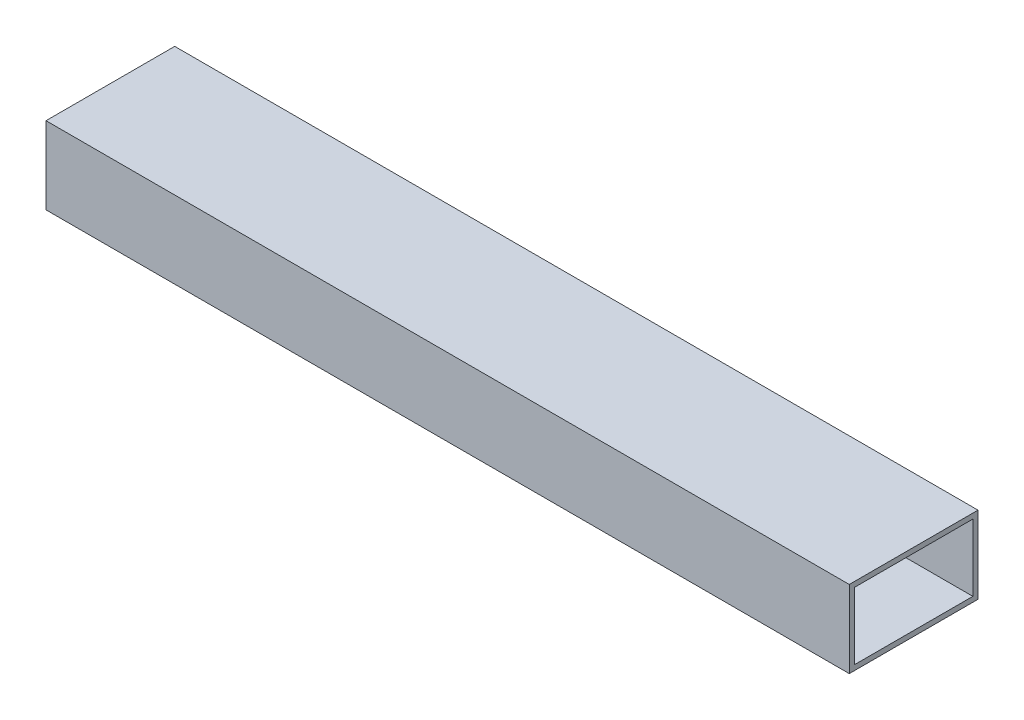
ISO-10303-21;
HEADER;
FILE_DESCRIPTION(('STEP AP214'),'2;1');
FILE_NAME('part.step','',(''),(''),'','','');
FILE_SCHEMA(('AUTOMOTIVE_DESIGN { 1 0 10303 214 1 1 1 1 }'));
ENDSEC;
DATA;
#1=APPLICATION_CONTEXT('core data for automotive mechanical design processes');
#2=APPLICATION_PROTOCOL_DEFINITION('international standard','automotive_design',2000,#1);
#3=PRODUCT_CONTEXT('',#1,'mechanical');
#4=PRODUCT('Part','Part','',(#3));
#5=PRODUCT_RELATED_PRODUCT_CATEGORY('part','',(#4));
#6=PRODUCT_DEFINITION_FORMATION('','',#4);
#7=PRODUCT_DEFINITION_CONTEXT('part definition',#1,'design');
#8=PRODUCT_DEFINITION('design','',#6,#7);
#9=PRODUCT_DEFINITION_SHAPE('','',#8);
#10=(LENGTH_UNIT() NAMED_UNIT(*) SI_UNIT(.MILLI.,.METRE.));
#11=(NAMED_UNIT(*) PLANE_ANGLE_UNIT() SI_UNIT($,.RADIAN.));
#12=(NAMED_UNIT(*) SI_UNIT($,.STERADIAN.) SOLID_ANGLE_UNIT());
#13=UNCERTAINTY_MEASURE_WITH_UNIT(LENGTH_MEASURE(1.E-05),#10,'distance_accuracy_value','');
#14=(GEOMETRIC_REPRESENTATION_CONTEXT(3) GLOBAL_UNCERTAINTY_ASSIGNED_CONTEXT((#13)) GLOBAL_UNIT_ASSIGNED_CONTEXT((#10,
#11,#12)) REPRESENTATION_CONTEXT('',''));
#15=CARTESIAN_POINT('',(0.,0.,0.));
#16=DIRECTION('',(0.,0.,1.));
#17=DIRECTION('',(1.,0.,0.));
#18=AXIS2_PLACEMENT_3D('',#15,#16,#17);
#19=CARTESIAN_POINT('',(-156.,40.,1525.));
#20=DIRECTION('',(1.,0.,0.));
#21=DIRECTION('',(0.,0.,-1.));
#22=AXIS2_PLACEMENT_3D('',#19,#20,#21);
#23=PLANE('',#22);
#24=DIRECTION('',(0.,0.,1.));
#25=VECTOR('',#24,1.);
#26=CARTESIAN_POINT('',(-156.,10.,1525.));
#27=LINE('',#26,#25);
#28=CARTESIAN_POINT('',(-156.,10.,1525.));
#29=VERTEX_POINT('',#28);
#30=CARTESIAN_POINT('',(-156.,10.,1575.));
#31=VERTEX_POINT('',#30);
#32=EDGE_CURVE('E135',#29,#31,#27,.T.);
#33=ORIENTED_EDGE('',*,*,#32,.T.);
#34=DIRECTION('',(0.,-1.,0.));
#35=VECTOR('',#34,1.);
#36=CARTESIAN_POINT('',(-156.,40.,1575.));
#37=LINE('',#36,#35);
#38=CARTESIAN_POINT('',(-156.,40.,1575.));
#39=VERTEX_POINT('',#38);
#40=EDGE_CURVE('E11',#39,#31,#37,.T.);
#41=ORIENTED_EDGE('',*,*,#40,.F.);
#42=DIRECTION('',(0.,0.,1.));
#43=VECTOR('',#42,1.);
#44=CARTESIAN_POINT('',(-156.,40.,1525.));
#45=LINE('',#44,#43);
#46=CARTESIAN_POINT('',(-156.,40.,1525.));
#47=VERTEX_POINT('',#46);
#48=EDGE_CURVE('E140',#47,#39,#45,.T.);
#49=ORIENTED_EDGE('',*,*,#48,.F.);
#50=DIRECTION('',(0.,-1.,0.));
#51=VECTOR('',#50,1.);
#52=CARTESIAN_POINT('',(-156.,40.,1525.));
#53=LINE('',#52,#51);
#54=EDGE_CURVE('E150',#47,#29,#53,.T.);
#55=ORIENTED_EDGE('',*,*,#54,.T.);
#56=EDGE_LOOP('',(#33,#41,#49,#55));
#57=FACE_BOUND('',#56,.T.);
#58=DIRECTION('',(0.,0.,1.));
#59=VECTOR('',#58,1.);
#60=CARTESIAN_POINT('',(-156.,12.,1525.));
#61=LINE('',#60,#59);
#62=CARTESIAN_POINT('',(-156.,12.,1527.));
#63=VERTEX_POINT('',#62);
#64=CARTESIAN_POINT('',(-156.,12.,1573.));
#65=VERTEX_POINT('',#64);
#66=EDGE_CURVE('E111',#63,#65,#61,.T.);
#67=ORIENTED_EDGE('',*,*,#66,.F.);
#68=DIRECTION('',(0.,-1.,0.));
#69=VECTOR('',#68,1.);
#70=CARTESIAN_POINT('',(-156.,40.,1527.));
#71=LINE('',#70,#69);
#72=CARTESIAN_POINT('',(-156.,38.,1527.));
#73=VERTEX_POINT('',#72);
#74=EDGE_CURVE('E131',#73,#63,#71,.T.);
#75=ORIENTED_EDGE('',*,*,#74,.F.);
#76=DIRECTION('',(0.,0.,1.));
#77=VECTOR('',#76,1.);
#78=CARTESIAN_POINT('',(-156.,38.,1525.));
#79=LINE('',#78,#77);
#80=CARTESIAN_POINT('',(-156.,38.,1573.));
#81=VERTEX_POINT('',#80);
#82=EDGE_CURVE('E55',#73,#81,#79,.T.);
#83=ORIENTED_EDGE('',*,*,#82,.T.);
#84=DIRECTION('',(0.,-1.,0.));
#85=VECTOR('',#84,1.);
#86=CARTESIAN_POINT('',(-156.,40.,1573.));
#87=LINE('',#86,#85);
#88=EDGE_CURVE('E121',#81,#65,#87,.T.);
#89=ORIENTED_EDGE('',*,*,#88,.T.);
#90=EDGE_LOOP('',(#67,#75,#83,#89));
#91=FACE_BOUND('',#90,.T.);
#92=ADVANCED_FACE('F41',(#57,#91),#23,.F.);
#93=CARTESIAN_POINT('',(156.,40.,1525.));
#94=DIRECTION('',(-1.,0.,0.));
#95=DIRECTION('',(0.,0.,1.));
#96=AXIS2_PLACEMENT_3D('',#93,#94,#95);
#97=PLANE('',#96);
#98=DIRECTION('',(0.,0.,-1.));
#99=VECTOR('',#98,1.);
#100=CARTESIAN_POINT('',(156.,10.,1525.));
#101=LINE('',#100,#99);
#102=CARTESIAN_POINT('',(156.,10.,1575.));
#103=VERTEX_POINT('',#102);
#104=CARTESIAN_POINT('',(156.,10.,1525.));
#105=VERTEX_POINT('',#104);
#106=EDGE_CURVE('E155',#103,#105,#101,.T.);
#107=ORIENTED_EDGE('',*,*,#106,.T.);
#108=DIRECTION('',(0.,-1.,0.));
#109=VECTOR('',#108,1.);
#110=CARTESIAN_POINT('',(156.,40.,1525.));
#111=LINE('',#110,#109);
#112=CARTESIAN_POINT('',(156.,40.,1525.));
#113=VERTEX_POINT('',#112);
#114=EDGE_CURVE('E160',#113,#105,#111,.T.);
#115=ORIENTED_EDGE('',*,*,#114,.F.);
#116=DIRECTION('',(0.,0.,-1.));
#117=VECTOR('',#116,1.);
#118=CARTESIAN_POINT('',(156.,40.,1525.));
#119=LINE('',#118,#117);
#120=CARTESIAN_POINT('',(156.,40.,1575.));
#121=VERTEX_POINT('',#120);
#122=EDGE_CURVE('E146',#121,#113,#119,.T.);
#123=ORIENTED_EDGE('',*,*,#122,.F.);
#124=DIRECTION('',(0.,-1.,0.));
#125=VECTOR('',#124,1.);
#126=CARTESIAN_POINT('',(156.,40.,1575.));
#127=LINE('',#126,#125);
#128=EDGE_CURVE('E48',#121,#103,#127,.T.);
#129=ORIENTED_EDGE('',*,*,#128,.T.);
#130=EDGE_LOOP('',(#107,#115,#123,#129));
#131=FACE_BOUND('',#130,.T.);
#132=DIRECTION('',(0.,0.,-1.));
#133=VECTOR('',#132,1.);
#134=CARTESIAN_POINT('',(156.,12.,1525.));
#135=LINE('',#134,#133);
#136=CARTESIAN_POINT('',(156.,12.,1573.));
#137=VERTEX_POINT('',#136);
#138=CARTESIAN_POINT('',(156.,12.,1527.));
#139=VERTEX_POINT('',#138);
#140=EDGE_CURVE('E108',#137,#139,#135,.T.);
#141=ORIENTED_EDGE('',*,*,#140,.F.);
#142=DIRECTION('',(0.,-1.,0.));
#143=VECTOR('',#142,1.);
#144=CARTESIAN_POINT('',(156.,40.,1573.));
#145=LINE('',#144,#143);
#146=CARTESIAN_POINT('',(156.,38.,1573.));
#147=VERTEX_POINT('',#146);
#148=EDGE_CURVE('E117',#147,#137,#145,.T.);
#149=ORIENTED_EDGE('',*,*,#148,.F.);
#150=DIRECTION('',(0.,0.,-1.));
#151=VECTOR('',#150,1.);
#152=CARTESIAN_POINT('',(156.,38.,1525.));
#153=LINE('',#152,#151);
#154=CARTESIAN_POINT('',(156.,38.,1527.));
#155=VERTEX_POINT('',#154);
#156=EDGE_CURVE('E60',#147,#155,#153,.T.);
#157=ORIENTED_EDGE('',*,*,#156,.T.);
#158=DIRECTION('',(0.,-1.,0.));
#159=VECTOR('',#158,1.);
#160=CARTESIAN_POINT('',(156.,40.,1527.));
#161=LINE('',#160,#159);
#162=EDGE_CURVE('E122',#155,#139,#161,.T.);
#163=ORIENTED_EDGE('',*,*,#162,.T.);
#164=EDGE_LOOP('',(#141,#149,#157,#163));
#165=FACE_BOUND('',#164,.T.);
#166=ADVANCED_FACE('F125',(#131,#165),#97,.F.);
#167=CARTESIAN_POINT('',(-156.,40.,1575.));
#168=DIRECTION('',(0.,0.,-1.));
#169=DIRECTION('',(-1.,0.,0.));
#170=AXIS2_PLACEMENT_3D('',#167,#168,#169);
#171=PLANE('',#170);
#172=DIRECTION('',(1.,0.,0.));
#173=VECTOR('',#172,1.);
#174=CARTESIAN_POINT('',(-156.,10.,1575.));
#175=LINE('',#174,#173);
#176=EDGE_CURVE('E153',#31,#103,#175,.T.);
#177=ORIENTED_EDGE('',*,*,#176,.T.);
#178=ORIENTED_EDGE('',*,*,#128,.F.);
#179=DIRECTION('',(1.,0.,0.));
#180=VECTOR('',#179,1.);
#181=CARTESIAN_POINT('',(-156.,40.,1575.));
#182=LINE('',#181,#180);
#183=EDGE_CURVE('E143',#39,#121,#182,.T.);
#184=ORIENTED_EDGE('',*,*,#183,.F.);
#185=ORIENTED_EDGE('',*,*,#40,.T.);
#186=EDGE_LOOP('',(#177,#178,#184,#185));
#187=FACE_BOUND('',#186,.T.);
#188=ADVANCED_FACE('F183',(#187),#171,.F.);
#189=CARTESIAN_POINT('',(-156.,40.,1525.));
#190=DIRECTION('',(0.,0.,1.));
#191=DIRECTION('',(1.,0.,0.));
#192=AXIS2_PLACEMENT_3D('',#189,#190,#191);
#193=PLANE('',#192);
#194=DIRECTION('',(-1.,0.,0.));
#195=VECTOR('',#194,1.);
#196=CARTESIAN_POINT('',(-156.,10.,1525.));
#197=LINE('',#196,#195);
#198=EDGE_CURVE('E144',#105,#29,#197,.T.);
#199=ORIENTED_EDGE('',*,*,#198,.T.);
#200=ORIENTED_EDGE('',*,*,#54,.F.);
#201=DIRECTION('',(-1.,0.,0.));
#202=VECTOR('',#201,1.);
#203=CARTESIAN_POINT('',(-156.,40.,1525.));
#204=LINE('',#203,#202);
#205=EDGE_CURVE('E148',#113,#47,#204,.T.);
#206=ORIENTED_EDGE('',*,*,#205,.F.);
#207=ORIENTED_EDGE('',*,*,#114,.T.);
#208=EDGE_LOOP('',(#199,#200,#206,#207));
#209=FACE_BOUND('',#208,.T.);
#210=ADVANCED_FACE('F175',(#209),#193,.F.);
#211=CARTESIAN_POINT('',(0.,40.,0.));
#212=DIRECTION('',(0.,1.,0.));
#213=DIRECTION('',(0.,0.,1.));
#214=AXIS2_PLACEMENT_3D('',#211,#212,#213);
#215=PLANE('',#214);
#216=ORIENTED_EDGE('',*,*,#48,.T.);
#217=ORIENTED_EDGE('',*,*,#183,.T.);
#218=ORIENTED_EDGE('',*,*,#122,.T.);
#219=ORIENTED_EDGE('',*,*,#205,.T.);
#220=EDGE_LOOP('',(#216,#217,#218,#219));
#221=FACE_BOUND('',#220,.T.);
#222=ADVANCED_FACE('F182',(#221),#215,.T.);
#223=CARTESIAN_POINT('',(0.,10.,0.));
#224=DIRECTION('',(0.,1.,0.));
#225=DIRECTION('',(0.,0.,1.));
#226=AXIS2_PLACEMENT_3D('',#223,#224,#225);
#227=PLANE('',#226);
#228=ORIENTED_EDGE('',*,*,#32,.F.);
#229=ORIENTED_EDGE('',*,*,#198,.F.);
#230=ORIENTED_EDGE('',*,*,#106,.F.);
#231=ORIENTED_EDGE('',*,*,#176,.F.);
#232=EDGE_LOOP('',(#228,#229,#230,#231));
#233=FACE_BOUND('',#232,.T.);
#234=ADVANCED_FACE('F172',(#233),#227,.F.);
#235=CARTESIAN_POINT('',(-156.,40.,1573.));
#236=DIRECTION('',(0.,0.,-1.));
#237=DIRECTION('',(-1.,0.,0.));
#238=AXIS2_PLACEMENT_3D('',#235,#236,#237);
#239=PLANE('',#238);
#240=DIRECTION('',(1.,0.,0.));
#241=VECTOR('',#240,1.);
#242=CARTESIAN_POINT('',(-156.,12.,1573.));
#243=LINE('',#242,#241);
#244=EDGE_CURVE('E104',#65,#137,#243,.T.);
#245=ORIENTED_EDGE('',*,*,#244,.F.);
#246=ORIENTED_EDGE('',*,*,#88,.F.);
#247=DIRECTION('',(1.,0.,0.));
#248=VECTOR('',#247,1.);
#249=CARTESIAN_POINT('',(-156.,38.,1573.));
#250=LINE('',#249,#248);
#251=EDGE_CURVE('E119',#81,#147,#250,.T.);
#252=ORIENTED_EDGE('',*,*,#251,.T.);
#253=ORIENTED_EDGE('',*,*,#148,.T.);
#254=EDGE_LOOP('',(#245,#246,#252,#253));
#255=FACE_BOUND('',#254,.T.);
#256=ADVANCED_FACE('F118',(#255),#239,.T.);
#257=CARTESIAN_POINT('',(-156.,40.,1527.));
#258=DIRECTION('',(0.,0.,1.));
#259=DIRECTION('',(1.,0.,0.));
#260=AXIS2_PLACEMENT_3D('',#257,#258,#259);
#261=PLANE('',#260);
#262=DIRECTION('',(-1.,0.,0.));
#263=VECTOR('',#262,1.);
#264=CARTESIAN_POINT('',(-156.,12.,1527.));
#265=LINE('',#264,#263);
#266=EDGE_CURVE('E126',#139,#63,#265,.T.);
#267=ORIENTED_EDGE('',*,*,#266,.F.);
#268=ORIENTED_EDGE('',*,*,#162,.F.);
#269=DIRECTION('',(-1.,0.,0.));
#270=VECTOR('',#269,1.);
#271=CARTESIAN_POINT('',(-156.,38.,1527.));
#272=LINE('',#271,#270);
#273=EDGE_CURVE('E133',#155,#73,#272,.T.);
#274=ORIENTED_EDGE('',*,*,#273,.T.);
#275=ORIENTED_EDGE('',*,*,#74,.T.);
#276=EDGE_LOOP('',(#267,#268,#274,#275));
#277=FACE_BOUND('',#276,.T.);
#278=ADVANCED_FACE('F232',(#277),#261,.T.);
#279=CARTESIAN_POINT('',(0.,38.,0.));
#280=DIRECTION('',(0.,1.,0.));
#281=DIRECTION('',(0.,0.,1.));
#282=AXIS2_PLACEMENT_3D('',#279,#280,#281);
#283=PLANE('',#282);
#284=ORIENTED_EDGE('',*,*,#82,.F.);
#285=ORIENTED_EDGE('',*,*,#273,.F.);
#286=ORIENTED_EDGE('',*,*,#156,.F.);
#287=ORIENTED_EDGE('',*,*,#251,.F.);
#288=EDGE_LOOP('',(#284,#285,#286,#287));
#289=FACE_BOUND('',#288,.T.);
#290=ADVANCED_FACE('F240',(#289),#283,.F.);
#291=CARTESIAN_POINT('',(0.,12.,0.));
#292=DIRECTION('',(0.,1.,0.));
#293=DIRECTION('',(0.,0.,1.));
#294=AXIS2_PLACEMENT_3D('',#291,#292,#293);
#295=PLANE('',#294);
#296=ORIENTED_EDGE('',*,*,#66,.T.);
#297=ORIENTED_EDGE('',*,*,#244,.T.);
#298=ORIENTED_EDGE('',*,*,#140,.T.);
#299=ORIENTED_EDGE('',*,*,#266,.T.);
#300=EDGE_LOOP('',(#296,#297,#298,#299));
#301=FACE_BOUND('',#300,.T.);
#302=ADVANCED_FACE('F106',(#301),#295,.T.);
#303=CLOSED_SHELL('',(#92,#166,#188,#210,#222,#234,#256,#278,#290,#302));
#304=MANIFOLD_SOLID_BREP('B2',#303);
#305=ADVANCED_BREP_SHAPE_REPRESENTATION('',(#18,#304),#14);
#306=SHAPE_DEFINITION_REPRESENTATION(#9,#305);
ENDSEC;
END-ISO-10303-21;
